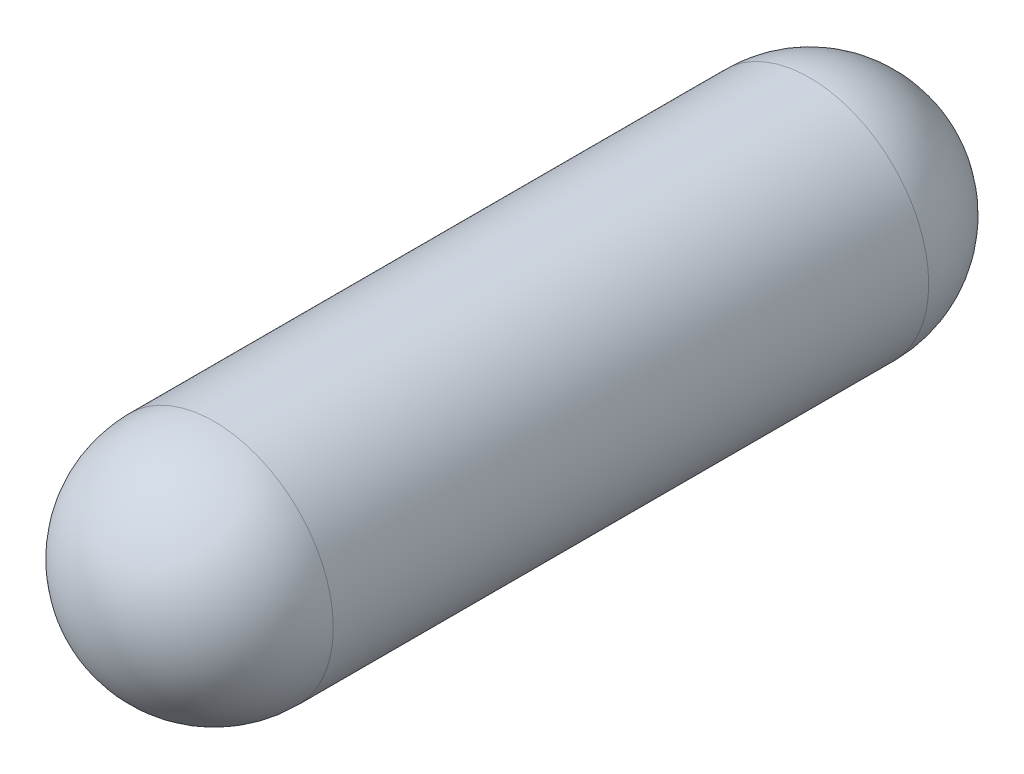
ISO-10303-21;
HEADER;
FILE_DESCRIPTION(('STEP AP214'),'2;1');
FILE_NAME('part.step','',(''),(''),'','','');
FILE_SCHEMA(('AUTOMOTIVE_DESIGN { 1 0 10303 214 1 1 1 1 }'));
ENDSEC;
DATA;
#1=APPLICATION_CONTEXT('core data for automotive mechanical design processes');
#2=APPLICATION_PROTOCOL_DEFINITION('international standard','automotive_design',2000,#1);
#3=PRODUCT_CONTEXT('',#1,'mechanical');
#4=PRODUCT('Part','Part','',(#3));
#5=PRODUCT_RELATED_PRODUCT_CATEGORY('part','',(#4));
#6=PRODUCT_DEFINITION_FORMATION('','',#4);
#7=PRODUCT_DEFINITION_CONTEXT('part definition',#1,'design');
#8=PRODUCT_DEFINITION('design','',#6,#7);
#9=PRODUCT_DEFINITION_SHAPE('','',#8);
#10=(LENGTH_UNIT() NAMED_UNIT(*) SI_UNIT(.MILLI.,.METRE.));
#11=(NAMED_UNIT(*) PLANE_ANGLE_UNIT() SI_UNIT($,.RADIAN.));
#12=(NAMED_UNIT(*) SI_UNIT($,.STERADIAN.) SOLID_ANGLE_UNIT());
#13=UNCERTAINTY_MEASURE_WITH_UNIT(LENGTH_MEASURE(1.E-05),#10,'distance_accuracy_value','');
#14=(GEOMETRIC_REPRESENTATION_CONTEXT(3) GLOBAL_UNCERTAINTY_ASSIGNED_CONTEXT((#13)) GLOBAL_UNIT_ASSIGNED_CONTEXT((#10,
#11,#12)) REPRESENTATION_CONTEXT('',''));
#15=CARTESIAN_POINT('',(0.,0.,0.));
#16=DIRECTION('',(0.,0.,1.));
#17=DIRECTION('',(1.,0.,0.));
#18=AXIS2_PLACEMENT_3D('',#15,#16,#17);
#19=CARTESIAN_POINT('',(0.,0.,10.));
#20=DIRECTION('',(0.,0.,-1.));
#21=DIRECTION('',(-1.,0.,0.));
#22=AXIS2_PLACEMENT_3D('',#19,#20,#21);
#23=CYLINDRICAL_SURFACE('',#22,2.);
#24=CARTESIAN_POINT('',(0.,0.,10.));
#25=DIRECTION('',(0.,0.,1.));
#26=DIRECTION('',(1.,0.,0.));
#27=AXIS2_PLACEMENT_3D('',#24,#25,#26);
#28=CIRCLE('',#27,2.);
#29=CARTESIAN_POINT('',(2.,0.,10.));
#30=VERTEX_POINT('',#29);
#31=EDGE_CURVE('E10',#30,#30,#28,.T.);
#32=ORIENTED_EDGE('',*,*,#31,.F.);
#33=EDGE_LOOP('',(#32));
#34=FACE_BOUND('',#33,.T.);
#35=CARTESIAN_POINT('',(0.,0.,0.));
#36=DIRECTION('',(0.,0.,1.));
#37=DIRECTION('',(1.,0.,0.));
#38=AXIS2_PLACEMENT_3D('',#35,#36,#37);
#39=CIRCLE('',#38,2.);
#40=CARTESIAN_POINT('',(2.,0.,0.));
#41=VERTEX_POINT('',#40);
#42=EDGE_CURVE('E44',#41,#41,#39,.F.);
#43=ORIENTED_EDGE('',*,*,#42,.F.);
#44=EDGE_LOOP('',(#43));
#45=FACE_BOUND('',#44,.T.);
#46=ADVANCED_FACE('F37',(#34,#45),#23,.T.);
#47=CARTESIAN_POINT('',(0.,0.,0.));
#48=DIRECTION('',(0.,0.,-1.));
#49=DIRECTION('',(1.,0.,0.));
#50=AXIS2_PLACEMENT_3D('',#47,#48,#49);
#51=SPHERICAL_SURFACE('',#50,2.);
#52=ORIENTED_EDGE('',*,*,#42,.T.);
#53=EDGE_LOOP('',(#52));
#54=FACE_BOUND('',#53,.T.);
#55=ADVANCED_FACE('F51',(#54),#51,.T.);
#56=CARTESIAN_POINT('',(0.,0.,10.));
#57=DIRECTION('',(0.,0.,-1.));
#58=DIRECTION('',(1.,0.,0.));
#59=AXIS2_PLACEMENT_3D('',#56,#57,#58);
#60=SPHERICAL_SURFACE('',#59,2.);
#61=ORIENTED_EDGE('',*,*,#31,.T.);
#62=EDGE_LOOP('',(#61));
#63=FACE_BOUND('',#62,.T.);
#64=ADVANCED_FACE('F58',(#63),#60,.T.);
#65=CLOSED_SHELL('',(#46,#55,#64));
#66=MANIFOLD_SOLID_BREP('B2',#65);
#67=ADVANCED_BREP_SHAPE_REPRESENTATION('',(#18,#66),#14);
#68=SHAPE_DEFINITION_REPRESENTATION(#9,#67);
ENDSEC;
END-ISO-10303-21;
